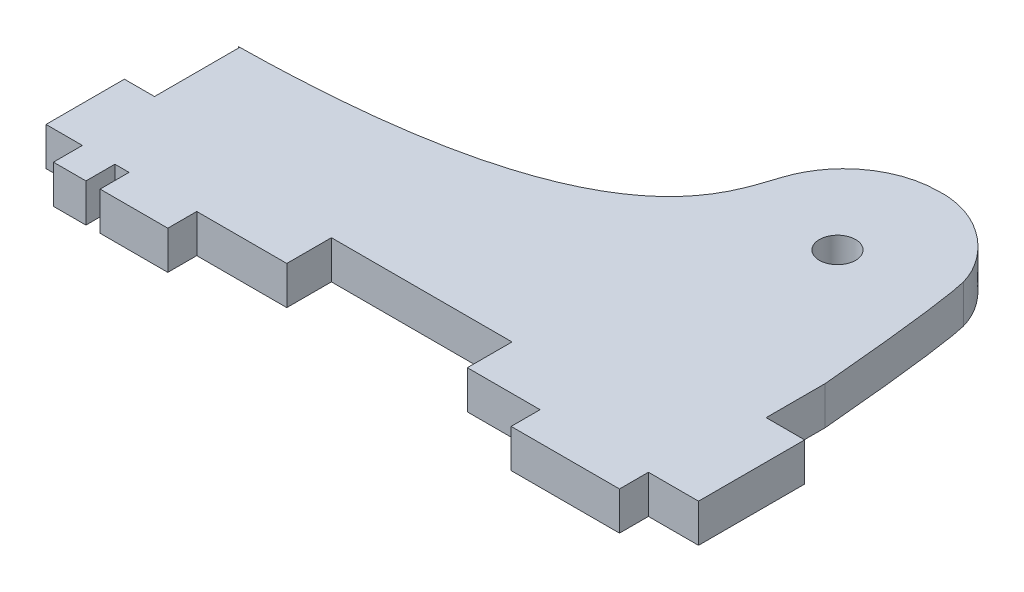
ISO-10303-21;
HEADER;
FILE_DESCRIPTION(('STEP AP214'),'2;1');
FILE_NAME('part.step','',(''),(''),'','','');
FILE_SCHEMA(('AUTOMOTIVE_DESIGN { 1 0 10303 214 1 1 1 1 }'));
ENDSEC;
DATA;
#1=APPLICATION_CONTEXT('core data for automotive mechanical design processes');
#2=APPLICATION_PROTOCOL_DEFINITION('international standard','automotive_design',2000,#1);
#3=PRODUCT_CONTEXT('',#1,'mechanical');
#4=PRODUCT('Part','Part','',(#3));
#5=PRODUCT_RELATED_PRODUCT_CATEGORY('part','',(#4));
#6=PRODUCT_DEFINITION_FORMATION('','',#4);
#7=PRODUCT_DEFINITION_CONTEXT('part definition',#1,'design');
#8=PRODUCT_DEFINITION('design','',#6,#7);
#9=PRODUCT_DEFINITION_SHAPE('','',#8);
#10=(LENGTH_UNIT() NAMED_UNIT(*) SI_UNIT(.MILLI.,.METRE.));
#11=(NAMED_UNIT(*) PLANE_ANGLE_UNIT() SI_UNIT($,.RADIAN.));
#12=(NAMED_UNIT(*) SI_UNIT($,.STERADIAN.) SOLID_ANGLE_UNIT());
#13=UNCERTAINTY_MEASURE_WITH_UNIT(LENGTH_MEASURE(1.E-05),#10,'distance_accuracy_value','');
#14=(GEOMETRIC_REPRESENTATION_CONTEXT(3) GLOBAL_UNCERTAINTY_ASSIGNED_CONTEXT((#13)) GLOBAL_UNIT_ASSIGNED_CONTEXT((#10,
#11,#12)) REPRESENTATION_CONTEXT('',''));
#15=CARTESIAN_POINT('',(0.,0.,0.));
#16=DIRECTION('',(0.,0.,1.));
#17=DIRECTION('',(1.,0.,0.));
#18=AXIS2_PLACEMENT_3D('',#15,#16,#17);
#19=CARTESIAN_POINT('',(25.5305545911677,3.175,-9.73151041246457));
#20=DIRECTION('',(0.,-1.,0.));
#21=DIRECTION('',(0.,0.,-1.));
#22=AXIS2_PLACEMENT_3D('',#19,#20,#21);
#23=PLANE('',#22);
#24=DIRECTION('',(0.,0.,-1.));
#25=VECTOR('',#24,1.);
#26=CARTESIAN_POINT('',(29.8619528692479,3.175,14.5575497370615));
#27=LINE('',#26,#25);
#28=CARTESIAN_POINT('',(29.8619528692479,3.175,14.5575497370615));
#29=VERTEX_POINT('',#28);
#30=CARTESIAN_POINT('',(29.8619528692479,3.175,5.75732199328827));
#31=VERTEX_POINT('',#30);
#32=EDGE_CURVE('E325',#29,#31,#27,.T.);
#33=ORIENTED_EDGE('',*,*,#32,.T.);
#34=DIRECTION('',(-1.,0.,0.));
#35=VECTOR('',#34,1.);
#36=CARTESIAN_POINT('',(29.8619528692479,3.175,5.75732199328827));
#37=LINE('',#36,#35);
#38=CARTESIAN_POINT('',(26.6676455875011,3.175,5.75732199328827));
#39=VERTEX_POINT('',#38);
#40=EDGE_CURVE('E152',#31,#39,#37,.T.);
#41=ORIENTED_EDGE('',*,*,#40,.T.);
#42=DIRECTION('',(0.,0.,-1.));
#43=VECTOR('',#42,1.);
#44=CARTESIAN_POINT('',(26.6676455875011,3.175,5.75732199328827));
#45=LINE('',#44,#43);
#46=CARTESIAN_POINT('',(26.6676455875011,3.175,0.857080759108619));
#47=VERTEX_POINT('',#46);
#48=EDGE_CURVE('E400',#39,#47,#45,.T.);
#49=ORIENTED_EDGE('',*,*,#48,.T.);
#50=CARTESIAN_POINT('',(26.6676455875011,3.175,0.857080759108619));
#51=CARTESIAN_POINT('',(25.7235630196056,3.175,-9.92292257590172));
#52=CARTESIAN_POINT('',(25.1036495054701,3.175,-12.2574199623824));
#53=CARTESIAN_POINT('',(25.0951535666132,3.175,-12.1681364439727));
#54=B_SPLINE_CURVE_WITH_KNOTS('',3,(#50,#51,#52,#53),.UNSPECIFIED.,.F.,.F.,(4,4),(3.,4.),.UNSPECIFIED.);
#55=CARTESIAN_POINT('',(25.0951535666132,3.175,-12.1681364439727));
#56=VERTEX_POINT('',#55);
#57=EDGE_CURVE('E419',#47,#56,#54,.T.);
#58=ORIENTED_EDGE('',*,*,#57,.T.);
#59=CARTESIAN_POINT('',(25.0951535666132,3.175,-12.1681364439727));
#60=CARTESIAN_POINT('',(24.4672559171787,3.175,-14.6328869791143));
#61=CARTESIAN_POINT('',(21.3273167950416,3.175,-17.8432847848991));
#62=CARTESIAN_POINT('',(17.5836347133851,3.175,-17.6473044346011));
#63=B_SPLINE_CURVE_WITH_KNOTS('',3,(#59,#60,#61,#62),.UNSPECIFIED.,.F.,.F.,(4,4),(4.,5.),.UNSPECIFIED.);
#64=CARTESIAN_POINT('',(17.5836347133851,3.175,-17.6473044346011));
#65=VERTEX_POINT('',#64);
#66=EDGE_CURVE('E416',#56,#65,#63,.T.);
#67=ORIENTED_EDGE('',*,*,#66,.T.);
#68=CARTESIAN_POINT('',(17.5836347133851,3.175,-17.6473044346011));
#69=CARTESIAN_POINT('',(14.1128170361997,3.175,-17.6473044347573));
#70=CARTESIAN_POINT('',(11.1651844402431,3.175,-15.4015729529257));
#71=CARTESIAN_POINT('',(10.1098699011999,3.175,-12.2818747793025));
#72=B_SPLINE_CURVE_WITH_KNOTS('',3,(#68,#69,#70,#71),.UNSPECIFIED.,.F.,.F.,(4,4),(5.,6.),.UNSPECIFIED.);
#73=CARTESIAN_POINT('',(10.1098699011999,3.175,-12.2818747793025));
#74=VERTEX_POINT('',#73);
#75=EDGE_CURVE('E418',#65,#74,#72,.T.);
#76=ORIENTED_EDGE('',*,*,#75,.T.);
#77=CARTESIAN_POINT('',(10.1098699011999,3.175,-12.2818747793025));
#78=CARTESIAN_POINT('',(8.87516090803586,3.175,-9.09925233210041));
#79=CARTESIAN_POINT('',(8.35356972874368,3.175,0.584552145151768));
#80=CARTESIAN_POINT('',(-21.8462222242708,3.175,0.989511790580655));
#81=B_SPLINE_CURVE_WITH_KNOTS('',3,(#77,#78,#79,#80),.UNSPECIFIED.,.F.,.F.,(4,4),(6.,7.),.UNSPECIFIED.);
#82=CARTESIAN_POINT('',(-21.8462222242708,3.175,0.989511790580655));
#83=VERTEX_POINT('',#82);
#84=EDGE_CURVE('E421',#74,#83,#81,.T.);
#85=ORIENTED_EDGE('',*,*,#84,.T.);
#86=DIRECTION('',(1.,0.,0.));
#87=VECTOR('',#86,1.);
#88=CARTESIAN_POINT('',(-21.8462222242708,3.175,0.989511790580655));
#89=LINE('',#88,#87);
#90=CARTESIAN_POINT('',(-21.7466203800272,3.175,0.989511790580655));
#91=VERTEX_POINT('',#90);
#92=EDGE_CURVE('E547',#83,#91,#89,.T.);
#93=ORIENTED_EDGE('',*,*,#92,.T.);
#94=DIRECTION('',(0.,0.,1.));
#95=VECTOR('',#94,1.);
#96=CARTESIAN_POINT('',(-21.7466203800272,3.175,0.989511790580655));
#97=LINE('',#96,#95);
#98=CARTESIAN_POINT('',(-21.7466203800272,3.175,8.05752013049443));
#99=VERTEX_POINT('',#98);
#100=EDGE_CURVE('E552',#91,#99,#97,.T.);
#101=ORIENTED_EDGE('',*,*,#100,.T.);
#102=DIRECTION('',(-1.,0.,0.));
#103=VECTOR('',#102,1.);
#104=CARTESIAN_POINT('',(-21.7466203800272,3.175,8.05752013049443));
#105=LINE('',#104,#103);
#106=CARTESIAN_POINT('',(-24.2422427075953,3.175,8.05752013049443));
#107=VERTEX_POINT('',#106);
#108=EDGE_CURVE('E554',#99,#107,#105,.T.);
#109=ORIENTED_EDGE('',*,*,#108,.T.);
#110=DIRECTION('',(0.,0.,1.));
#111=VECTOR('',#110,1.);
#112=CARTESIAN_POINT('',(-24.2422427075953,3.175,8.05752013049443));
#113=LINE('',#112,#111);
#114=CARTESIAN_POINT('',(-24.2422427075953,3.175,14.5575497370628));
#115=VERTEX_POINT('',#114);
#116=EDGE_CURVE('E556',#107,#115,#113,.T.);
#117=ORIENTED_EDGE('',*,*,#116,.T.);
#118=DIRECTION('',(1.,0.,0.));
#119=VECTOR('',#118,1.);
#120=CARTESIAN_POINT('',(-24.2422427075953,3.175,14.5575497370628));
#121=LINE('',#120,#119);
#122=CARTESIAN_POINT('',(-21.2259260759523,3.175,14.5575497370628));
#123=VERTEX_POINT('',#122);
#124=EDGE_CURVE('E558',#115,#123,#121,.T.);
#125=ORIENTED_EDGE('',*,*,#124,.T.);
#126=DIRECTION('',(0.,0.,1.));
#127=VECTOR('',#126,1.);
#128=CARTESIAN_POINT('',(-21.2259260759523,3.175,14.5575497370628));
#129=LINE('',#128,#127);
#130=CARTESIAN_POINT('',(-21.2259260759523,3.175,16.9577157275192));
#131=VERTEX_POINT('',#130);
#132=EDGE_CURVE('E560',#123,#131,#129,.T.);
#133=ORIENTED_EDGE('',*,*,#132,.T.);
#134=DIRECTION('',(1.,0.,0.));
#135=VECTOR('',#134,1.);
#136=CARTESIAN_POINT('',(-21.2259260759523,3.175,16.9577157275192));
#137=LINE('',#136,#135);
#138=CARTESIAN_POINT('',(-18.5307881034505,3.175,16.9577157275192));
#139=VERTEX_POINT('',#138);
#140=EDGE_CURVE('E562',#131,#139,#137,.T.);
#141=ORIENTED_EDGE('',*,*,#140,.T.);
#142=DIRECTION('',(0.,0.,-1.));
#143=VECTOR('',#142,1.);
#144=CARTESIAN_POINT('',(-18.5307881034505,3.175,16.9577157275192));
#145=LINE('',#144,#143);
#146=CARTESIAN_POINT('',(-18.5307881034505,3.175,14.5575497370628));
#147=VERTEX_POINT('',#146);
#148=EDGE_CURVE('E564',#139,#147,#145,.T.);
#149=ORIENTED_EDGE('',*,*,#148,.T.);
#150=DIRECTION('',(1.,0.,0.));
#151=VECTOR('',#150,1.);
#152=CARTESIAN_POINT('',(-18.5307881034505,3.175,14.5575497370628));
#153=LINE('',#152,#151);
#154=CARTESIAN_POINT('',(-17.3543418511656,3.175,14.5575497370628));
#155=VERTEX_POINT('',#154);
#156=EDGE_CURVE('E566',#147,#155,#153,.T.);
#157=ORIENTED_EDGE('',*,*,#156,.T.);
#158=DIRECTION('',(0.,0.,1.));
#159=VECTOR('',#158,1.);
#160=CARTESIAN_POINT('',(-17.3543418511656,3.175,14.5575497370628));
#161=LINE('',#160,#159);
#162=CARTESIAN_POINT('',(-17.3543418511656,3.175,16.9577157275192));
#163=VERTEX_POINT('',#162);
#164=EDGE_CURVE('E568',#155,#163,#161,.T.);
#165=ORIENTED_EDGE('',*,*,#164,.T.);
#166=DIRECTION('',(1.,0.,0.));
#167=VECTOR('',#166,1.);
#168=CARTESIAN_POINT('',(-17.3543418511656,3.175,16.9577157275192));
#169=LINE('',#168,#167);
#170=CARTESIAN_POINT('',(-11.7427425558773,3.175,16.9577157275192));
#171=VERTEX_POINT('',#170);
#172=EDGE_CURVE('E570',#163,#171,#169,.T.);
#173=ORIENTED_EDGE('',*,*,#172,.T.);
#174=DIRECTION('',(0.,0.,-1.));
#175=VECTOR('',#174,1.);
#176=CARTESIAN_POINT('',(-11.7427425558773,3.175,16.9577157275192));
#177=LINE('',#176,#175);
#178=CARTESIAN_POINT('',(-11.7427425558773,3.175,14.5575497370616));
#179=VERTEX_POINT('',#178);
#180=EDGE_CURVE('E572',#171,#179,#177,.T.);
#181=ORIENTED_EDGE('',*,*,#180,.T.);
#182=DIRECTION('',(1.,0.,0.));
#183=VECTOR('',#182,1.);
#184=CARTESIAN_POINT('',(-11.7427425558773,3.175,14.5575497370616));
#185=LINE('',#184,#183);
#186=CARTESIAN_POINT('',(-4.27754192325813,3.175,14.5575497370616));
#187=VERTEX_POINT('',#186);
#188=EDGE_CURVE('E574',#179,#187,#185,.T.);
#189=ORIENTED_EDGE('',*,*,#188,.T.);
#190=DIRECTION('',(0.,0.,-1.));
#191=VECTOR('',#190,1.);
#192=CARTESIAN_POINT('',(-4.27754192325813,3.175,14.5575497370616));
#193=LINE('',#192,#191);
#194=CARTESIAN_POINT('',(-4.27754192325813,3.175,10.8573231340089));
#195=VERTEX_POINT('',#194);
#196=EDGE_CURVE('E576',#187,#195,#193,.T.);
#197=ORIENTED_EDGE('',*,*,#196,.T.);
#198=DIRECTION('',(1.,0.,0.));
#199=VECTOR('',#198,1.);
#200=CARTESIAN_POINT('',(-4.27754192325813,3.175,10.8573231340089));
#201=LINE('',#200,#199);
#202=CARTESIAN_POINT('',(10.6959239545789,3.175,10.8573231340089));
#203=VERTEX_POINT('',#202);
#204=EDGE_CURVE('E578',#195,#203,#201,.T.);
#205=ORIENTED_EDGE('',*,*,#204,.T.);
#206=DIRECTION('',(0.,0.,1.));
#207=VECTOR('',#206,1.);
#208=CARTESIAN_POINT('',(10.6959239545789,3.175,10.8573231340089));
#209=LINE('',#208,#207);
#210=CARTESIAN_POINT('',(10.6959239545789,3.175,14.557422775156));
#211=VERTEX_POINT('',#210);
#212=EDGE_CURVE('E580',#203,#211,#209,.T.);
#213=ORIENTED_EDGE('',*,*,#212,.T.);
#214=DIRECTION('',(1.,0.,0.));
#215=VECTOR('',#214,1.);
#216=CARTESIAN_POINT('',(10.6959239545789,3.175,14.557422775156));
#217=LINE('',#216,#215);
#218=CARTESIAN_POINT('',(16.7242678167232,3.175,14.557422775156));
#219=VERTEX_POINT('',#218);
#220=EDGE_CURVE('E582',#211,#219,#217,.T.);
#221=ORIENTED_EDGE('',*,*,#220,.T.);
#222=DIRECTION('',(0.,0.,1.));
#223=VECTOR('',#222,1.);
#224=CARTESIAN_POINT('',(16.7242678167232,3.175,14.557422775156));
#225=LINE('',#224,#223);
#226=CARTESIAN_POINT('',(16.7242678167232,3.175,16.9577157275178));
#227=VERTEX_POINT('',#226);
#228=EDGE_CURVE('E231',#219,#227,#225,.T.);
#229=ORIENTED_EDGE('',*,*,#228,.T.);
#230=DIRECTION('',(1.,0.,0.));
#231=VECTOR('',#230,1.);
#232=CARTESIAN_POINT('',(16.7242678167232,3.175,16.9577157275178));
#233=LINE('',#232,#231);
#234=CARTESIAN_POINT('',(25.7085476779573,3.175,16.9577157275178));
#235=VERTEX_POINT('',#234);
#236=EDGE_CURVE('E225',#227,#235,#233,.T.);
#237=ORIENTED_EDGE('',*,*,#236,.T.);
#238=DIRECTION('',(0.,0.,-1.));
#239=VECTOR('',#238,1.);
#240=CARTESIAN_POINT('',(25.7085476779573,3.175,16.9577157275178));
#241=LINE('',#240,#239);
#242=CARTESIAN_POINT('',(25.7085476779573,3.175,14.5575497370615));
#243=VERTEX_POINT('',#242);
#244=EDGE_CURVE('E229',#235,#243,#241,.T.);
#245=ORIENTED_EDGE('',*,*,#244,.T.);
#246=DIRECTION('',(1.,0.,0.));
#247=VECTOR('',#246,1.);
#248=CARTESIAN_POINT('',(25.7085476779573,3.175,14.5575497370615));
#249=LINE('',#248,#247);
#250=EDGE_CURVE('E49',#243,#29,#249,.T.);
#251=ORIENTED_EDGE('',*,*,#250,.T.);
#252=EDGE_LOOP('',(#33,#41,#49,#58,#67,#76,#85,#93,#101,#109,#117,#125,#133,#141,#149,#157,#165,
#173,#181,#189,#197,#205,#213,#221,#229,#237,#245,#251));
#253=FACE_BOUND('',#252,.T.);
#254=CARTESIAN_POINT('',(17.5836980797728,3.175,-9.24322713234592));
#255=DIRECTION('',(0.,1.,0.));
#256=DIRECTION('',(0.,0.,1.));
#257=AXIS2_PLACEMENT_3D('',#254,#255,#256);
#258=CIRCLE('',#257,1.49997678346856);
#259=CARTESIAN_POINT('',(17.5836980797728,3.175,-7.74325034887736));
#260=VERTEX_POINT('',#259);
#261=EDGE_CURVE('E253',#260,#260,#258,.T.);
#262=ORIENTED_EDGE('',*,*,#261,.F.);
#263=EDGE_LOOP('',(#262));
#264=FACE_BOUND('',#263,.T.);
#265=ADVANCED_FACE('F32',(#253,#264),#23,.F.);
#266=CARTESIAN_POINT('',(25.5305545911677,0.,-9.73151041246457));
#267=DIRECTION('',(0.,-1.,0.));
#268=DIRECTION('',(0.,0.,-1.));
#269=AXIS2_PLACEMENT_3D('',#266,#267,#268);
#270=PLANE('',#269);
#271=DIRECTION('',(0.,0.,-1.));
#272=VECTOR('',#271,1.);
#273=CARTESIAN_POINT('',(29.8619528692479,0.,14.5575497370615));
#274=LINE('',#273,#272);
#275=CARTESIAN_POINT('',(29.8619528692479,0.,14.5575497370615));
#276=VERTEX_POINT('',#275);
#277=CARTESIAN_POINT('',(29.8619528692479,0.,5.75732199328827));
#278=VERTEX_POINT('',#277);
#279=EDGE_CURVE('E249',#276,#278,#274,.T.);
#280=ORIENTED_EDGE('',*,*,#279,.F.);
#281=DIRECTION('',(1.,0.,0.));
#282=VECTOR('',#281,1.);
#283=CARTESIAN_POINT('',(25.7085476779573,0.,14.5575497370615));
#284=LINE('',#283,#282);
#285=CARTESIAN_POINT('',(25.7085476779573,0.,14.5575497370615));
#286=VERTEX_POINT('',#285);
#287=EDGE_CURVE('E144',#286,#276,#284,.T.);
#288=ORIENTED_EDGE('',*,*,#287,.F.);
#289=DIRECTION('',(0.,0.,-1.));
#290=VECTOR('',#289,1.);
#291=CARTESIAN_POINT('',(25.7085476779573,0.,16.9577157275178));
#292=LINE('',#291,#290);
#293=CARTESIAN_POINT('',(25.7085476779573,0.,16.9577157275178));
#294=VERTEX_POINT('',#293);
#295=EDGE_CURVE('E138',#294,#286,#292,.T.);
#296=ORIENTED_EDGE('',*,*,#295,.F.);
#297=DIRECTION('',(1.,0.,0.));
#298=VECTOR('',#297,1.);
#299=CARTESIAN_POINT('',(16.7242678167232,0.,16.9577157275178));
#300=LINE('',#299,#298);
#301=CARTESIAN_POINT('',(16.7242678167232,0.,16.9577157275178));
#302=VERTEX_POINT('',#301);
#303=EDGE_CURVE('E239',#302,#294,#300,.T.);
#304=ORIENTED_EDGE('',*,*,#303,.F.);
#305=DIRECTION('',(0.,0.,1.));
#306=VECTOR('',#305,1.);
#307=CARTESIAN_POINT('',(16.7242678167232,0.,14.557422775156));
#308=LINE('',#307,#306);
#309=CARTESIAN_POINT('',(16.7242678167232,0.,14.557422775156));
#310=VERTEX_POINT('',#309);
#311=EDGE_CURVE('E320',#310,#302,#308,.T.);
#312=ORIENTED_EDGE('',*,*,#311,.F.);
#313=DIRECTION('',(1.,0.,0.));
#314=VECTOR('',#313,1.);
#315=CARTESIAN_POINT('',(10.6959239545789,0.,14.557422775156));
#316=LINE('',#315,#314);
#317=CARTESIAN_POINT('',(10.6959239545789,0.,14.557422775156));
#318=VERTEX_POINT('',#317);
#319=EDGE_CURVE('E318',#318,#310,#316,.T.);
#320=ORIENTED_EDGE('',*,*,#319,.F.);
#321=DIRECTION('',(0.,0.,1.));
#322=VECTOR('',#321,1.);
#323=CARTESIAN_POINT('',(10.6959239545789,0.,10.8573231340089));
#324=LINE('',#323,#322);
#325=CARTESIAN_POINT('',(10.6959239545789,0.,10.8573231340089));
#326=VERTEX_POINT('',#325);
#327=EDGE_CURVE('E316',#326,#318,#324,.T.);
#328=ORIENTED_EDGE('',*,*,#327,.F.);
#329=DIRECTION('',(1.,0.,0.));
#330=VECTOR('',#329,1.);
#331=CARTESIAN_POINT('',(-4.27754192325813,0.,10.8573231340089));
#332=LINE('',#331,#330);
#333=CARTESIAN_POINT('',(-4.27754192325813,0.,10.8573231340089));
#334=VERTEX_POINT('',#333);
#335=EDGE_CURVE('E314',#334,#326,#332,.T.);
#336=ORIENTED_EDGE('',*,*,#335,.F.);
#337=DIRECTION('',(0.,0.,-1.));
#338=VECTOR('',#337,1.);
#339=CARTESIAN_POINT('',(-4.27754192325813,0.,14.5575497370616));
#340=LINE('',#339,#338);
#341=CARTESIAN_POINT('',(-4.27754192325813,0.,14.5575497370616));
#342=VERTEX_POINT('',#341);
#343=EDGE_CURVE('E312',#342,#334,#340,.T.);
#344=ORIENTED_EDGE('',*,*,#343,.F.);
#345=DIRECTION('',(1.,0.,0.));
#346=VECTOR('',#345,1.);
#347=CARTESIAN_POINT('',(-4.29038088076655,0.,14.5575497370616));
#348=LINE('',#347,#346);
#349=CARTESIAN_POINT('',(-11.7427425558773,0.,14.5575497370616));
#350=VERTEX_POINT('',#349);
#351=EDGE_CURVE('E310',#350,#342,#348,.T.);
#352=ORIENTED_EDGE('',*,*,#351,.F.);
#353=DIRECTION('',(0.,0.,-1.));
#354=VECTOR('',#353,1.);
#355=CARTESIAN_POINT('',(-11.7427425558773,0.,16.9577157275192));
#356=LINE('',#355,#354);
#357=CARTESIAN_POINT('',(-11.7427425558773,0.,16.9577157275192));
#358=VERTEX_POINT('',#357);
#359=EDGE_CURVE('E307',#358,#350,#356,.T.);
#360=ORIENTED_EDGE('',*,*,#359,.F.);
#361=DIRECTION('',(1.,0.,0.));
#362=VECTOR('',#361,1.);
#363=CARTESIAN_POINT('',(-17.3543418511656,0.,16.9577157275192));
#364=LINE('',#363,#362);
#365=CARTESIAN_POINT('',(-17.3543418511656,0.,16.9577157275192));
#366=VERTEX_POINT('',#365);
#367=EDGE_CURVE('E305',#366,#358,#364,.T.);
#368=ORIENTED_EDGE('',*,*,#367,.F.);
#369=DIRECTION('',(0.,0.,1.));
#370=VECTOR('',#369,1.);
#371=CARTESIAN_POINT('',(-17.3543418511656,0.,14.5575497370628));
#372=LINE('',#371,#370);
#373=CARTESIAN_POINT('',(-17.3543418511656,0.,14.5575497370628));
#374=VERTEX_POINT('',#373);
#375=EDGE_CURVE('E303',#374,#366,#372,.T.);
#376=ORIENTED_EDGE('',*,*,#375,.F.);
#377=DIRECTION('',(1.,0.,0.));
#378=VECTOR('',#377,1.);
#379=CARTESIAN_POINT('',(-18.5307881034505,0.,14.5575497370628));
#380=LINE('',#379,#378);
#381=CARTESIAN_POINT('',(-18.5307881034505,0.,14.5575497370628));
#382=VERTEX_POINT('',#381);
#383=EDGE_CURVE('E301',#382,#374,#380,.T.);
#384=ORIENTED_EDGE('',*,*,#383,.F.);
#385=DIRECTION('',(0.,0.,-1.));
#386=VECTOR('',#385,1.);
#387=CARTESIAN_POINT('',(-18.5307881034505,0.,16.9577157275192));
#388=LINE('',#387,#386);
#389=CARTESIAN_POINT('',(-18.5307881034505,0.,16.9577157275192));
#390=VERTEX_POINT('',#389);
#391=EDGE_CURVE('E299',#390,#382,#388,.T.);
#392=ORIENTED_EDGE('',*,*,#391,.F.);
#393=DIRECTION('',(1.,0.,0.));
#394=VECTOR('',#393,1.);
#395=CARTESIAN_POINT('',(-21.2259260759523,0.,16.9577157275192));
#396=LINE('',#395,#394);
#397=CARTESIAN_POINT('',(-21.2259260759523,0.,16.9577157275192));
#398=VERTEX_POINT('',#397);
#399=EDGE_CURVE('E297',#398,#390,#396,.T.);
#400=ORIENTED_EDGE('',*,*,#399,.F.);
#401=DIRECTION('',(0.,0.,1.));
#402=VECTOR('',#401,1.);
#403=CARTESIAN_POINT('',(-21.2259260759523,0.,14.5575497370628));
#404=LINE('',#403,#402);
#405=CARTESIAN_POINT('',(-21.2259260759523,0.,14.5575497370628));
#406=VERTEX_POINT('',#405);
#407=EDGE_CURVE('E295',#406,#398,#404,.T.);
#408=ORIENTED_EDGE('',*,*,#407,.F.);
#409=DIRECTION('',(1.,0.,0.));
#410=VECTOR('',#409,1.);
#411=CARTESIAN_POINT('',(-24.2422427075953,0.,14.5575497370628));
#412=LINE('',#411,#410);
#413=CARTESIAN_POINT('',(-24.2422427075953,0.,14.5575497370628));
#414=VERTEX_POINT('',#413);
#415=EDGE_CURVE('E293',#414,#406,#412,.T.);
#416=ORIENTED_EDGE('',*,*,#415,.F.);
#417=DIRECTION('',(0.,0.,1.));
#418=VECTOR('',#417,1.);
#419=CARTESIAN_POINT('',(-24.2422427075953,0.,8.05752013049443));
#420=LINE('',#419,#418);
#421=CARTESIAN_POINT('',(-24.2422427075953,0.,8.05752013049443));
#422=VERTEX_POINT('',#421);
#423=EDGE_CURVE('E291',#422,#414,#420,.T.);
#424=ORIENTED_EDGE('',*,*,#423,.F.);
#425=DIRECTION('',(-1.,0.,0.));
#426=VECTOR('',#425,1.);
#427=CARTESIAN_POINT('',(-21.7466203800272,0.,8.05752013049443));
#428=LINE('',#427,#426);
#429=CARTESIAN_POINT('',(-21.7466203800272,0.,8.05752013049443));
#430=VERTEX_POINT('',#429);
#431=EDGE_CURVE('E289',#430,#422,#428,.T.);
#432=ORIENTED_EDGE('',*,*,#431,.F.);
#433=DIRECTION('',(0.,0.,1.));
#434=VECTOR('',#433,1.);
#435=CARTESIAN_POINT('',(-21.7466203800272,0.,0.989511790580655));
#436=LINE('',#435,#434);
#437=CARTESIAN_POINT('',(-21.7466203800272,0.,0.989511790580655));
#438=VERTEX_POINT('',#437);
#439=EDGE_CURVE('E287',#438,#430,#436,.T.);
#440=ORIENTED_EDGE('',*,*,#439,.F.);
#441=DIRECTION('',(1.,0.,0.));
#442=VECTOR('',#441,1.);
#443=CARTESIAN_POINT('',(-21.8462222242708,0.,0.989511790580655));
#444=LINE('',#443,#442);
#445=CARTESIAN_POINT('',(-21.8462222242708,0.,0.989511790580655));
#446=VERTEX_POINT('',#445);
#447=EDGE_CURVE('E282',#446,#438,#444,.T.);
#448=ORIENTED_EDGE('',*,*,#447,.F.);
#449=CARTESIAN_POINT('',(10.1098699011999,0.,-12.2818747793025));
#450=CARTESIAN_POINT('',(8.87516090803586,0.,-9.09925233210041));
#451=CARTESIAN_POINT('',(8.35356972874368,0.,0.584552145151768));
#452=CARTESIAN_POINT('',(-21.8462222242708,0.,0.989511790580655));
#453=B_SPLINE_CURVE_WITH_KNOTS('',3,(#449,#450,#451,#452),.UNSPECIFIED.,.F.,.F.,(4,4),(6.,7.),.UNSPECIFIED.);
#454=CARTESIAN_POINT('',(10.1098699011999,0.,-12.2818747793025));
#455=VERTEX_POINT('',#454);
#456=EDGE_CURVE('E275',#455,#446,#453,.T.);
#457=ORIENTED_EDGE('',*,*,#456,.F.);
#458=CARTESIAN_POINT('',(17.5836347133851,0.,-17.6473044346011));
#459=CARTESIAN_POINT('',(14.1128170361997,0.,-17.6473044347573));
#460=CARTESIAN_POINT('',(11.1651844402431,0.,-15.4015729529257));
#461=CARTESIAN_POINT('',(10.1098699011999,0.,-12.2818747793025));
#462=B_SPLINE_CURVE_WITH_KNOTS('',3,(#458,#459,#460,#461),.UNSPECIFIED.,.F.,.F.,(4,4),(5.,6.),.UNSPECIFIED.);
#463=CARTESIAN_POINT('',(17.5836347133851,0.,-17.6473044346011));
#464=VERTEX_POINT('',#463);
#465=EDGE_CURVE('E268',#464,#455,#462,.T.);
#466=ORIENTED_EDGE('',*,*,#465,.F.);
#467=CARTESIAN_POINT('',(25.0951535666132,0.,-12.1681364439727));
#468=CARTESIAN_POINT('',(24.4672559171787,0.,-14.6328869791143));
#469=CARTESIAN_POINT('',(21.3273167950416,0.,-17.8432847848991));
#470=CARTESIAN_POINT('',(17.5836347133851,0.,-17.6473044346011));
#471=B_SPLINE_CURVE_WITH_KNOTS('',3,(#467,#468,#469,#470),.UNSPECIFIED.,.F.,.F.,(4,4),(4.,5.),.UNSPECIFIED.);
#472=CARTESIAN_POINT('',(25.0951535666132,0.,-12.1681364439727));
#473=VERTEX_POINT('',#472);
#474=EDGE_CURVE('E261',#473,#464,#471,.T.);
#475=ORIENTED_EDGE('',*,*,#474,.F.);
#476=CARTESIAN_POINT('',(26.6676455875011,0.,0.857080759108619));
#477=CARTESIAN_POINT('',(25.7235630196056,0.,-9.92292257590172));
#478=CARTESIAN_POINT('',(25.1036495054701,0.,-12.2574199623824));
#479=CARTESIAN_POINT('',(25.0951535666132,0.,-12.1681364439727));
#480=B_SPLINE_CURVE_WITH_KNOTS('',3,(#476,#477,#478,#479),.UNSPECIFIED.,.F.,.F.,(4,4),(3.,4.),.UNSPECIFIED.);
#481=CARTESIAN_POINT('',(26.6676455875011,0.,0.857080759108619));
#482=VERTEX_POINT('',#481);
#483=EDGE_CURVE('E257',#482,#473,#480,.T.);
#484=ORIENTED_EDGE('',*,*,#483,.F.);
#485=DIRECTION('',(0.,0.,-1.));
#486=VECTOR('',#485,1.);
#487=CARTESIAN_POINT('',(26.6676455875011,0.,5.75732199328827));
#488=LINE('',#487,#486);
#489=CARTESIAN_POINT('',(26.6676455875011,0.,5.75732199328827));
#490=VERTEX_POINT('',#489);
#491=EDGE_CURVE('E255',#490,#482,#488,.T.);
#492=ORIENTED_EDGE('',*,*,#491,.F.);
#493=DIRECTION('',(-1.,0.,0.));
#494=VECTOR('',#493,1.);
#495=CARTESIAN_POINT('',(29.8619528692479,0.,5.75732199328827));
#496=LINE('',#495,#494);
#497=EDGE_CURVE('E252',#278,#490,#496,.T.);
#498=ORIENTED_EDGE('',*,*,#497,.F.);
#499=EDGE_LOOP('',(#280,#288,#296,#304,#312,#320,#328,#336,#344,#352,#360,#368,#376,#384,#392,
#400,#408,#416,#424,#432,#440,#448,#457,#466,#475,#484,#492,#498));
#500=FACE_BOUND('',#499,.T.);
#501=CARTESIAN_POINT('',(17.5836980797728,0.,-9.24322713234592));
#502=DIRECTION('',(0.,1.,0.));
#503=DIRECTION('',(0.,0.,1.));
#504=AXIS2_PLACEMENT_3D('',#501,#502,#503);
#505=CIRCLE('',#504,1.49997678346856);
#506=CARTESIAN_POINT('',(17.5836980797728,0.,-7.74325034887736));
#507=VERTEX_POINT('',#506);
#508=EDGE_CURVE('E594',#507,#507,#505,.T.);
#509=ORIENTED_EDGE('',*,*,#508,.T.);
#510=EDGE_LOOP('',(#509));
#511=FACE_BOUND('',#510,.T.);
#512=ADVANCED_FACE('F404',(#500,#511),#270,.T.);
#513=CARTESIAN_POINT('',(29.8619528692479,3.175,14.5575497370615));
#514=DIRECTION('',(-1.,0.,0.));
#515=DIRECTION('',(0.,0.,1.));
#516=AXIS2_PLACEMENT_3D('',#513,#514,#515);
#517=PLANE('',#516);
#518=ORIENTED_EDGE('',*,*,#279,.T.);
#519=DIRECTION('',(0.,-1.,0.));
#520=VECTOR('',#519,1.);
#521=CARTESIAN_POINT('',(29.8619528692479,3.175,5.75732199328827));
#522=LINE('',#521,#520);
#523=EDGE_CURVE('E11',#31,#278,#522,.T.);
#524=ORIENTED_EDGE('',*,*,#523,.F.);
#525=ORIENTED_EDGE('',*,*,#32,.F.);
#526=DIRECTION('',(0.,-1.,0.));
#527=VECTOR('',#526,1.);
#528=CARTESIAN_POINT('',(29.8619528692479,3.175,14.5575497370615));
#529=LINE('',#528,#527);
#530=EDGE_CURVE('E245',#29,#276,#529,.T.);
#531=ORIENTED_EDGE('',*,*,#530,.T.);
#532=EDGE_LOOP('',(#518,#524,#525,#531));
#533=FACE_BOUND('',#532,.T.);
#534=ADVANCED_FACE('F34',(#533),#517,.F.);
#535=CARTESIAN_POINT('',(29.8619528692479,3.175,5.75732199328827));
#536=DIRECTION('',(0.,0.,1.));
#537=DIRECTION('',(1.,0.,0.));
#538=AXIS2_PLACEMENT_3D('',#535,#536,#537);
#539=PLANE('',#538);
#540=ORIENTED_EDGE('',*,*,#497,.T.);
#541=DIRECTION('',(0.,-1.,0.));
#542=VECTOR('',#541,1.);
#543=CARTESIAN_POINT('',(26.6676455875011,3.175,5.75732199328827));
#544=LINE('',#543,#542);
#545=EDGE_CURVE('E41',#39,#490,#544,.T.);
#546=ORIENTED_EDGE('',*,*,#545,.F.);
#547=ORIENTED_EDGE('',*,*,#40,.F.);
#548=ORIENTED_EDGE('',*,*,#523,.T.);
#549=EDGE_LOOP('',(#540,#546,#547,#548));
#550=FACE_BOUND('',#549,.T.);
#551=ADVANCED_FACE('F447',(#550),#539,.F.);
#552=CARTESIAN_POINT('',(26.6676455875011,3.175,5.75732199328827));
#553=DIRECTION('',(-1.,0.,0.));
#554=DIRECTION('',(0.,0.,1.));
#555=AXIS2_PLACEMENT_3D('',#552,#553,#554);
#556=PLANE('',#555);
#557=ORIENTED_EDGE('',*,*,#491,.T.);
#558=DIRECTION('',(0.,-1.,0.));
#559=VECTOR('',#558,1.);
#560=CARTESIAN_POINT('',(26.6676455875011,3.175,0.857080759108619));
#561=LINE('',#560,#559);
#562=EDGE_CURVE('E392',#47,#482,#561,.T.);
#563=ORIENTED_EDGE('',*,*,#562,.F.);
#564=ORIENTED_EDGE('',*,*,#48,.F.);
#565=ORIENTED_EDGE('',*,*,#545,.T.);
#566=EDGE_LOOP('',(#557,#563,#564,#565));
#567=FACE_BOUND('',#566,.T.);
#568=ADVANCED_FACE('F398',(#567),#556,.F.);
#569=DIRECTION('',(0.,-1.,0.));
#570=VECTOR('',#569,1.);
#571=SURFACE_OF_LINEAR_EXTRUSION('',#54,#570);
#572=ORIENTED_EDGE('',*,*,#483,.T.);
#573=DIRECTION('',(0.,-1.,0.));
#574=VECTOR('',#573,1.);
#575=CARTESIAN_POINT('',(25.0951535666132,3.175,-12.1681364439727));
#576=LINE('',#575,#574);
#577=EDGE_CURVE('E389',#56,#473,#576,.T.);
#578=ORIENTED_EDGE('',*,*,#577,.F.);
#579=ORIENTED_EDGE('',*,*,#57,.F.);
#580=ORIENTED_EDGE('',*,*,#562,.T.);
#581=EDGE_LOOP('',(#572,#578,#579,#580));
#582=FACE_BOUND('',#581,.T.);
#583=ADVANCED_FACE('F410',(#582),#571,.F.);
#584=DIRECTION('',(0.,-1.,0.));
#585=VECTOR('',#584,1.);
#586=SURFACE_OF_LINEAR_EXTRUSION('',#63,#585);
#587=ORIENTED_EDGE('',*,*,#474,.T.);
#588=DIRECTION('',(0.,-1.,0.));
#589=VECTOR('',#588,1.);
#590=CARTESIAN_POINT('',(17.5836347133851,3.175,-17.6473044346011));
#591=LINE('',#590,#589);
#592=EDGE_CURVE('E386',#65,#464,#591,.T.);
#593=ORIENTED_EDGE('',*,*,#592,.F.);
#594=ORIENTED_EDGE('',*,*,#66,.F.);
#595=ORIENTED_EDGE('',*,*,#577,.T.);
#596=EDGE_LOOP('',(#587,#593,#594,#595));
#597=FACE_BOUND('',#596,.T.);
#598=ADVANCED_FACE('F414',(#597),#586,.F.);
#599=DIRECTION('',(0.,-1.,0.));
#600=VECTOR('',#599,1.);
#601=SURFACE_OF_LINEAR_EXTRUSION('',#72,#600);
#602=ORIENTED_EDGE('',*,*,#465,.T.);
#603=DIRECTION('',(0.,-1.,0.));
#604=VECTOR('',#603,1.);
#605=CARTESIAN_POINT('',(10.1098699011999,3.175,-12.2818747793025));
#606=LINE('',#605,#604);
#607=EDGE_CURVE('E383',#74,#455,#606,.T.);
#608=ORIENTED_EDGE('',*,*,#607,.F.);
#609=ORIENTED_EDGE('',*,*,#75,.F.);
#610=ORIENTED_EDGE('',*,*,#592,.T.);
#611=EDGE_LOOP('',(#602,#608,#609,#610));
#612=FACE_BOUND('',#611,.T.);
#613=ADVANCED_FACE('F442',(#612),#601,.F.);
#614=DIRECTION('',(0.,-1.,0.));
#615=VECTOR('',#614,1.);
#616=SURFACE_OF_LINEAR_EXTRUSION('',#81,#615);
#617=ORIENTED_EDGE('',*,*,#456,.T.);
#618=DIRECTION('',(0.,-1.,0.));
#619=VECTOR('',#618,1.);
#620=CARTESIAN_POINT('',(-21.8462222242708,3.175,0.989511790580655));
#621=LINE('',#620,#619);
#622=EDGE_CURVE('E380',#83,#446,#621,.T.);
#623=ORIENTED_EDGE('',*,*,#622,.F.);
#624=ORIENTED_EDGE('',*,*,#84,.F.);
#625=ORIENTED_EDGE('',*,*,#607,.T.);
#626=EDGE_LOOP('',(#617,#623,#624,#625));
#627=FACE_BOUND('',#626,.T.);
#628=ADVANCED_FACE('F539',(#627),#616,.F.);
#629=CARTESIAN_POINT('',(-21.8462222242708,3.175,0.989511790580655));
#630=DIRECTION('',(0.,0.,-1.));
#631=DIRECTION('',(-1.,0.,0.));
#632=AXIS2_PLACEMENT_3D('',#629,#630,#631);
#633=PLANE('',#632);
#634=ORIENTED_EDGE('',*,*,#447,.T.);
#635=DIRECTION('',(0.,-1.,0.));
#636=VECTOR('',#635,1.);
#637=CARTESIAN_POINT('',(-21.7466203800272,3.175,0.989511790580655));
#638=LINE('',#637,#636);
#639=EDGE_CURVE('E377',#91,#438,#638,.T.);
#640=ORIENTED_EDGE('',*,*,#639,.F.);
#641=ORIENTED_EDGE('',*,*,#92,.F.);
#642=ORIENTED_EDGE('',*,*,#622,.T.);
#643=EDGE_LOOP('',(#634,#640,#641,#642));
#644=FACE_BOUND('',#643,.T.);
#645=ADVANCED_FACE('F536',(#644),#633,.F.);
#646=CARTESIAN_POINT('',(-21.7466203800272,3.175,0.989511790580655));
#647=DIRECTION('',(1.,0.,0.));
#648=DIRECTION('',(0.,0.,-1.));
#649=AXIS2_PLACEMENT_3D('',#646,#647,#648);
#650=PLANE('',#649);
#651=ORIENTED_EDGE('',*,*,#439,.T.);
#652=DIRECTION('',(0.,-1.,0.));
#653=VECTOR('',#652,1.);
#654=CARTESIAN_POINT('',(-21.7466203800272,3.175,8.05752013049443));
#655=LINE('',#654,#653);
#656=EDGE_CURVE('E374',#99,#430,#655,.T.);
#657=ORIENTED_EDGE('',*,*,#656,.F.);
#658=ORIENTED_EDGE('',*,*,#100,.F.);
#659=ORIENTED_EDGE('',*,*,#639,.T.);
#660=EDGE_LOOP('',(#651,#657,#658,#659));
#661=FACE_BOUND('',#660,.T.);
#662=ADVANCED_FACE('F532',(#661),#650,.F.);
#663=CARTESIAN_POINT('',(-21.7466203800272,3.175,8.05752013049443));
#664=DIRECTION('',(0.,0.,1.));
#665=DIRECTION('',(1.,0.,0.));
#666=AXIS2_PLACEMENT_3D('',#663,#664,#665);
#667=PLANE('',#666);
#668=ORIENTED_EDGE('',*,*,#431,.T.);
#669=DIRECTION('',(0.,-1.,0.));
#670=VECTOR('',#669,1.);
#671=CARTESIAN_POINT('',(-24.2422427075953,3.175,8.05752013049443));
#672=LINE('',#671,#670);
#673=EDGE_CURVE('E371',#107,#422,#672,.T.);
#674=ORIENTED_EDGE('',*,*,#673,.F.);
#675=ORIENTED_EDGE('',*,*,#108,.F.);
#676=ORIENTED_EDGE('',*,*,#656,.T.);
#677=EDGE_LOOP('',(#668,#674,#675,#676));
#678=FACE_BOUND('',#677,.T.);
#679=ADVANCED_FACE('F528',(#678),#667,.F.);
#680=CARTESIAN_POINT('',(-24.2422427075953,3.175,8.05752013049443));
#681=DIRECTION('',(1.,0.,0.));
#682=DIRECTION('',(0.,0.,-1.));
#683=AXIS2_PLACEMENT_3D('',#680,#681,#682);
#684=PLANE('',#683);
#685=ORIENTED_EDGE('',*,*,#423,.T.);
#686=DIRECTION('',(0.,-1.,0.));
#687=VECTOR('',#686,1.);
#688=CARTESIAN_POINT('',(-24.2422427075953,3.175,14.5575497370628));
#689=LINE('',#688,#687);
#690=EDGE_CURVE('E368',#115,#414,#689,.T.);
#691=ORIENTED_EDGE('',*,*,#690,.F.);
#692=ORIENTED_EDGE('',*,*,#116,.F.);
#693=ORIENTED_EDGE('',*,*,#673,.T.);
#694=EDGE_LOOP('',(#685,#691,#692,#693));
#695=FACE_BOUND('',#694,.T.);
#696=ADVANCED_FACE('F524',(#695),#684,.F.);
#697=CARTESIAN_POINT('',(-24.2422427075953,3.175,14.5575497370628));
#698=DIRECTION('',(0.,0.,-1.));
#699=DIRECTION('',(-1.,0.,0.));
#700=AXIS2_PLACEMENT_3D('',#697,#698,#699);
#701=PLANE('',#700);
#702=ORIENTED_EDGE('',*,*,#415,.T.);
#703=DIRECTION('',(0.,-1.,0.));
#704=VECTOR('',#703,1.);
#705=CARTESIAN_POINT('',(-21.2259260759523,3.175,14.5575497370628));
#706=LINE('',#705,#704);
#707=EDGE_CURVE('E365',#123,#406,#706,.T.);
#708=ORIENTED_EDGE('',*,*,#707,.F.);
#709=ORIENTED_EDGE('',*,*,#124,.F.);
#710=ORIENTED_EDGE('',*,*,#690,.T.);
#711=EDGE_LOOP('',(#702,#708,#709,#710));
#712=FACE_BOUND('',#711,.T.);
#713=ADVANCED_FACE('F520',(#712),#701,.F.);
#714=CARTESIAN_POINT('',(-21.2259260759523,3.175,14.5575497370628));
#715=DIRECTION('',(1.,0.,0.));
#716=DIRECTION('',(0.,0.,-1.));
#717=AXIS2_PLACEMENT_3D('',#714,#715,#716);
#718=PLANE('',#717);
#719=ORIENTED_EDGE('',*,*,#407,.T.);
#720=DIRECTION('',(0.,-1.,0.));
#721=VECTOR('',#720,1.);
#722=CARTESIAN_POINT('',(-21.2259260759523,3.175,16.9577157275192));
#723=LINE('',#722,#721);
#724=EDGE_CURVE('E362',#131,#398,#723,.T.);
#725=ORIENTED_EDGE('',*,*,#724,.F.);
#726=ORIENTED_EDGE('',*,*,#132,.F.);
#727=ORIENTED_EDGE('',*,*,#707,.T.);
#728=EDGE_LOOP('',(#719,#725,#726,#727));
#729=FACE_BOUND('',#728,.T.);
#730=ADVANCED_FACE('F516',(#729),#718,.F.);
#731=CARTESIAN_POINT('',(-21.2259260759523,3.175,16.9577157275192));
#732=DIRECTION('',(0.,0.,-1.));
#733=DIRECTION('',(-1.,0.,0.));
#734=AXIS2_PLACEMENT_3D('',#731,#732,#733);
#735=PLANE('',#734);
#736=ORIENTED_EDGE('',*,*,#399,.T.);
#737=DIRECTION('',(0.,-1.,0.));
#738=VECTOR('',#737,1.);
#739=CARTESIAN_POINT('',(-18.5307881034505,3.175,16.9577157275192));
#740=LINE('',#739,#738);
#741=EDGE_CURVE('E359',#139,#390,#740,.T.);
#742=ORIENTED_EDGE('',*,*,#741,.F.);
#743=ORIENTED_EDGE('',*,*,#140,.F.);
#744=ORIENTED_EDGE('',*,*,#724,.T.);
#745=EDGE_LOOP('',(#736,#742,#743,#744));
#746=FACE_BOUND('',#745,.T.);
#747=ADVANCED_FACE('F512',(#746),#735,.F.);
#748=CARTESIAN_POINT('',(-18.5307881034505,3.175,16.9577157275192));
#749=DIRECTION('',(-1.,0.,0.));
#750=DIRECTION('',(0.,0.,1.));
#751=AXIS2_PLACEMENT_3D('',#748,#749,#750);
#752=PLANE('',#751);
#753=ORIENTED_EDGE('',*,*,#391,.T.);
#754=DIRECTION('',(0.,-1.,0.));
#755=VECTOR('',#754,1.);
#756=CARTESIAN_POINT('',(-18.5307881034505,3.175,14.5575497370628));
#757=LINE('',#756,#755);
#758=EDGE_CURVE('E356',#147,#382,#757,.T.);
#759=ORIENTED_EDGE('',*,*,#758,.F.);
#760=ORIENTED_EDGE('',*,*,#148,.F.);
#761=ORIENTED_EDGE('',*,*,#741,.T.);
#762=EDGE_LOOP('',(#753,#759,#760,#761));
#763=FACE_BOUND('',#762,.T.);
#764=ADVANCED_FACE('F508',(#763),#752,.F.);
#765=CARTESIAN_POINT('',(-18.5307881034505,3.175,14.5575497370628));
#766=DIRECTION('',(0.,0.,-1.));
#767=DIRECTION('',(-1.,0.,0.));
#768=AXIS2_PLACEMENT_3D('',#765,#766,#767);
#769=PLANE('',#768);
#770=ORIENTED_EDGE('',*,*,#383,.T.);
#771=DIRECTION('',(0.,-1.,0.));
#772=VECTOR('',#771,1.);
#773=CARTESIAN_POINT('',(-17.3543418511656,3.175,14.5575497370628));
#774=LINE('',#773,#772);
#775=EDGE_CURVE('E353',#155,#374,#774,.T.);
#776=ORIENTED_EDGE('',*,*,#775,.F.);
#777=ORIENTED_EDGE('',*,*,#156,.F.);
#778=ORIENTED_EDGE('',*,*,#758,.T.);
#779=EDGE_LOOP('',(#770,#776,#777,#778));
#780=FACE_BOUND('',#779,.T.);
#781=ADVANCED_FACE('F504',(#780),#769,.F.);
#782=CARTESIAN_POINT('',(-17.3543418511656,3.175,14.5575497370628));
#783=DIRECTION('',(1.,0.,0.));
#784=DIRECTION('',(0.,0.,-1.));
#785=AXIS2_PLACEMENT_3D('',#782,#783,#784);
#786=PLANE('',#785);
#787=ORIENTED_EDGE('',*,*,#375,.T.);
#788=DIRECTION('',(0.,-1.,0.));
#789=VECTOR('',#788,1.);
#790=CARTESIAN_POINT('',(-17.3543418511656,3.175,16.9577157275192));
#791=LINE('',#790,#789);
#792=EDGE_CURVE('E350',#163,#366,#791,.T.);
#793=ORIENTED_EDGE('',*,*,#792,.F.);
#794=ORIENTED_EDGE('',*,*,#164,.F.);
#795=ORIENTED_EDGE('',*,*,#775,.T.);
#796=EDGE_LOOP('',(#787,#793,#794,#795));
#797=FACE_BOUND('',#796,.T.);
#798=ADVANCED_FACE('F500',(#797),#786,.F.);
#799=CARTESIAN_POINT('',(-17.3543418511656,3.175,16.9577157275192));
#800=DIRECTION('',(0.,0.,-1.));
#801=DIRECTION('',(-1.,0.,0.));
#802=AXIS2_PLACEMENT_3D('',#799,#800,#801);
#803=PLANE('',#802);
#804=ORIENTED_EDGE('',*,*,#367,.T.);
#805=DIRECTION('',(0.,-1.,0.));
#806=VECTOR('',#805,1.);
#807=CARTESIAN_POINT('',(-11.7427425558773,3.175,16.9577157275192));
#808=LINE('',#807,#806);
#809=EDGE_CURVE('E347',#171,#358,#808,.T.);
#810=ORIENTED_EDGE('',*,*,#809,.F.);
#811=ORIENTED_EDGE('',*,*,#172,.F.);
#812=ORIENTED_EDGE('',*,*,#792,.T.);
#813=EDGE_LOOP('',(#804,#810,#811,#812));
#814=FACE_BOUND('',#813,.T.);
#815=ADVANCED_FACE('F496',(#814),#803,.F.);
#816=CARTESIAN_POINT('',(-11.7427425558773,3.175,16.9577157275192));
#817=DIRECTION('',(-1.,0.,0.));
#818=DIRECTION('',(0.,0.,1.));
#819=AXIS2_PLACEMENT_3D('',#816,#817,#818);
#820=PLANE('',#819);
#821=ORIENTED_EDGE('',*,*,#359,.T.);
#822=DIRECTION('',(0.,-1.,0.));
#823=VECTOR('',#822,1.);
#824=CARTESIAN_POINT('',(-11.7427425558773,3.175,14.5575497370616));
#825=LINE('',#824,#823);
#826=EDGE_CURVE('E344',#179,#350,#825,.T.);
#827=ORIENTED_EDGE('',*,*,#826,.F.);
#828=ORIENTED_EDGE('',*,*,#180,.F.);
#829=ORIENTED_EDGE('',*,*,#809,.T.);
#830=EDGE_LOOP('',(#821,#827,#828,#829));
#831=FACE_BOUND('',#830,.T.);
#832=ADVANCED_FACE('F492',(#831),#820,.F.);
#833=CARTESIAN_POINT('',(-4.29038088076655,3.175,14.5575497370616));
#834=DIRECTION('',(0.,0.,-1.));
#835=DIRECTION('',(-1.,0.,0.));
#836=AXIS2_PLACEMENT_3D('',#833,#834,#835);
#837=PLANE('',#836);
#838=ORIENTED_EDGE('',*,*,#351,.T.);
#839=DIRECTION('',(0.,-1.,0.));
#840=VECTOR('',#839,1.);
#841=CARTESIAN_POINT('',(-4.27754192325813,3.175,14.5575497370616));
#842=LINE('',#841,#840);
#843=EDGE_CURVE('E341',#187,#342,#842,.T.);
#844=ORIENTED_EDGE('',*,*,#843,.F.);
#845=ORIENTED_EDGE('',*,*,#188,.F.);
#846=ORIENTED_EDGE('',*,*,#826,.T.);
#847=EDGE_LOOP('',(#838,#844,#845,#846));
#848=FACE_BOUND('',#847,.T.);
#849=ADVANCED_FACE('F488',(#848),#837,.F.);
#850=CARTESIAN_POINT('',(-4.27754192325813,3.175,14.5575497370616));
#851=DIRECTION('',(-1.,0.,0.));
#852=DIRECTION('',(0.,0.,1.));
#853=AXIS2_PLACEMENT_3D('',#850,#851,#852);
#854=PLANE('',#853);
#855=ORIENTED_EDGE('',*,*,#343,.T.);
#856=DIRECTION('',(0.,-1.,0.));
#857=VECTOR('',#856,1.);
#858=CARTESIAN_POINT('',(-4.27754192325813,3.175,10.8573231340089));
#859=LINE('',#858,#857);
#860=EDGE_CURVE('E338',#195,#334,#859,.T.);
#861=ORIENTED_EDGE('',*,*,#860,.F.);
#862=ORIENTED_EDGE('',*,*,#196,.F.);
#863=ORIENTED_EDGE('',*,*,#843,.T.);
#864=EDGE_LOOP('',(#855,#861,#862,#863));
#865=FACE_BOUND('',#864,.T.);
#866=ADVANCED_FACE('F484',(#865),#854,.F.);
#867=CARTESIAN_POINT('',(-4.27754192325813,3.175,10.8573231340089));
#868=DIRECTION('',(0.,0.,-1.));
#869=DIRECTION('',(-1.,0.,0.));
#870=AXIS2_PLACEMENT_3D('',#867,#868,#869);
#871=PLANE('',#870);
#872=ORIENTED_EDGE('',*,*,#335,.T.);
#873=DIRECTION('',(0.,-1.,0.));
#874=VECTOR('',#873,1.);
#875=CARTESIAN_POINT('',(10.6959239545789,3.175,10.8573231340089));
#876=LINE('',#875,#874);
#877=EDGE_CURVE('E335',#203,#326,#876,.T.);
#878=ORIENTED_EDGE('',*,*,#877,.F.);
#879=ORIENTED_EDGE('',*,*,#204,.F.);
#880=ORIENTED_EDGE('',*,*,#860,.T.);
#881=EDGE_LOOP('',(#872,#878,#879,#880));
#882=FACE_BOUND('',#881,.T.);
#883=ADVANCED_FACE('F480',(#882),#871,.F.);
#884=CARTESIAN_POINT('',(10.6959239545789,3.175,10.8573231340089));
#885=DIRECTION('',(1.,0.,0.));
#886=DIRECTION('',(0.,0.,-1.));
#887=AXIS2_PLACEMENT_3D('',#884,#885,#886);
#888=PLANE('',#887);
#889=ORIENTED_EDGE('',*,*,#327,.T.);
#890=DIRECTION('',(0.,-1.,0.));
#891=VECTOR('',#890,1.);
#892=CARTESIAN_POINT('',(10.6959239545789,3.175,14.557422775156));
#893=LINE('',#892,#891);
#894=EDGE_CURVE('E332',#211,#318,#893,.T.);
#895=ORIENTED_EDGE('',*,*,#894,.F.);
#896=ORIENTED_EDGE('',*,*,#212,.F.);
#897=ORIENTED_EDGE('',*,*,#877,.T.);
#898=EDGE_LOOP('',(#889,#895,#896,#897));
#899=FACE_BOUND('',#898,.T.);
#900=ADVANCED_FACE('F476',(#899),#888,.F.);
#901=CARTESIAN_POINT('',(10.6959239545789,3.175,14.557422775156));
#902=DIRECTION('',(0.,0.,-1.));
#903=DIRECTION('',(-1.,0.,0.));
#904=AXIS2_PLACEMENT_3D('',#901,#902,#903);
#905=PLANE('',#904);
#906=ORIENTED_EDGE('',*,*,#319,.T.);
#907=DIRECTION('',(0.,-1.,0.));
#908=VECTOR('',#907,1.);
#909=CARTESIAN_POINT('',(16.7242678167232,3.175,14.557422775156));
#910=LINE('',#909,#908);
#911=EDGE_CURVE('E329',#219,#310,#910,.T.);
#912=ORIENTED_EDGE('',*,*,#911,.F.);
#913=ORIENTED_EDGE('',*,*,#220,.F.);
#914=ORIENTED_EDGE('',*,*,#894,.T.);
#915=EDGE_LOOP('',(#906,#912,#913,#914));
#916=FACE_BOUND('',#915,.T.);
#917=ADVANCED_FACE('F472',(#916),#905,.F.);
#918=CARTESIAN_POINT('',(16.7242678167232,3.175,14.557422775156));
#919=DIRECTION('',(1.,0.,0.));
#920=DIRECTION('',(0.,0.,-1.));
#921=AXIS2_PLACEMENT_3D('',#918,#919,#920);
#922=PLANE('',#921);
#923=ORIENTED_EDGE('',*,*,#311,.T.);
#924=DIRECTION('',(0.,-1.,0.));
#925=VECTOR('',#924,1.);
#926=CARTESIAN_POINT('',(16.7242678167232,3.175,16.9577157275178));
#927=LINE('',#926,#925);
#928=EDGE_CURVE('E240',#227,#302,#927,.T.);
#929=ORIENTED_EDGE('',*,*,#928,.F.);
#930=ORIENTED_EDGE('',*,*,#228,.F.);
#931=ORIENTED_EDGE('',*,*,#911,.T.);
#932=EDGE_LOOP('',(#923,#929,#930,#931));
#933=FACE_BOUND('',#932,.T.);
#934=ADVANCED_FACE('F469',(#933),#922,.F.);
#935=CARTESIAN_POINT('',(16.7242678167232,3.175,16.9577157275178));
#936=DIRECTION('',(0.,0.,-1.));
#937=DIRECTION('',(-1.,0.,0.));
#938=AXIS2_PLACEMENT_3D('',#935,#936,#937);
#939=PLANE('',#938);
#940=ORIENTED_EDGE('',*,*,#303,.T.);
#941=DIRECTION('',(0.,-1.,0.));
#942=VECTOR('',#941,1.);
#943=CARTESIAN_POINT('',(25.7085476779573,3.175,16.9577157275178));
#944=LINE('',#943,#942);
#945=EDGE_CURVE('E236',#235,#294,#944,.T.);
#946=ORIENTED_EDGE('',*,*,#945,.F.);
#947=ORIENTED_EDGE('',*,*,#236,.F.);
#948=ORIENTED_EDGE('',*,*,#928,.T.);
#949=EDGE_LOOP('',(#940,#946,#947,#948));
#950=FACE_BOUND('',#949,.T.);
#951=ADVANCED_FACE('F237',(#950),#939,.F.);
#952=CARTESIAN_POINT('',(25.7085476779573,3.175,16.9577157275178));
#953=DIRECTION('',(-1.,0.,0.));
#954=DIRECTION('',(0.,0.,1.));
#955=AXIS2_PLACEMENT_3D('',#952,#953,#954);
#956=PLANE('',#955);
#957=ORIENTED_EDGE('',*,*,#295,.T.);
#958=DIRECTION('',(0.,-1.,0.));
#959=VECTOR('',#958,1.);
#960=CARTESIAN_POINT('',(25.7085476779573,3.175,14.5575497370615));
#961=LINE('',#960,#959);
#962=EDGE_CURVE('E241',#243,#286,#961,.T.);
#963=ORIENTED_EDGE('',*,*,#962,.F.);
#964=ORIENTED_EDGE('',*,*,#244,.F.);
#965=ORIENTED_EDGE('',*,*,#945,.T.);
#966=EDGE_LOOP('',(#957,#963,#964,#965));
#967=FACE_BOUND('',#966,.T.);
#968=ADVANCED_FACE('F243',(#967),#956,.F.);
#969=CARTESIAN_POINT('',(25.7085476779573,3.175,14.5575497370615));
#970=DIRECTION('',(0.,0.,-1.));
#971=DIRECTION('',(-1.,0.,0.));
#972=AXIS2_PLACEMENT_3D('',#969,#970,#971);
#973=PLANE('',#972);
#974=ORIENTED_EDGE('',*,*,#287,.T.);
#975=ORIENTED_EDGE('',*,*,#530,.F.);
#976=ORIENTED_EDGE('',*,*,#250,.F.);
#977=ORIENTED_EDGE('',*,*,#962,.T.);
#978=EDGE_LOOP('',(#974,#975,#976,#977));
#979=FACE_BOUND('',#978,.T.);
#980=ADVANCED_FACE('F462',(#979),#973,.F.);
#981=CARTESIAN_POINT('',(17.5836980797728,3.175,-9.24322713234592));
#982=DIRECTION('',(0.,-1.,0.));
#983=DIRECTION('',(0.,0.,-1.));
#984=AXIS2_PLACEMENT_3D('',#981,#982,#983);
#985=CYLINDRICAL_SURFACE('',#984,1.49997678346856);
#986=ORIENTED_EDGE('',*,*,#261,.T.);
#987=EDGE_LOOP('',(#986));
#988=FACE_BOUND('',#987,.T.);
#989=ORIENTED_EDGE('',*,*,#508,.F.);
#990=EDGE_LOOP('',(#989));
#991=FACE_BOUND('',#990,.T.);
#992=ADVANCED_FACE('F460',(#988,#991),#985,.F.);
#993=CLOSED_SHELL('',(#265,#512,#534,#551,#568,#583,#598,#613,#628,#645,#662,#679,#696,#713,
#730,#747,#764,#781,#798,#815,#832,#849,#866,#883,#900,#917,#934,#951,#968,#980,#992));
#994=MANIFOLD_SOLID_BREP('B2',#993);
#995=ADVANCED_BREP_SHAPE_REPRESENTATION('',(#18,#994),#14);
#996=SHAPE_DEFINITION_REPRESENTATION(#9,#995);
ENDSEC;
END-ISO-10303-21;
